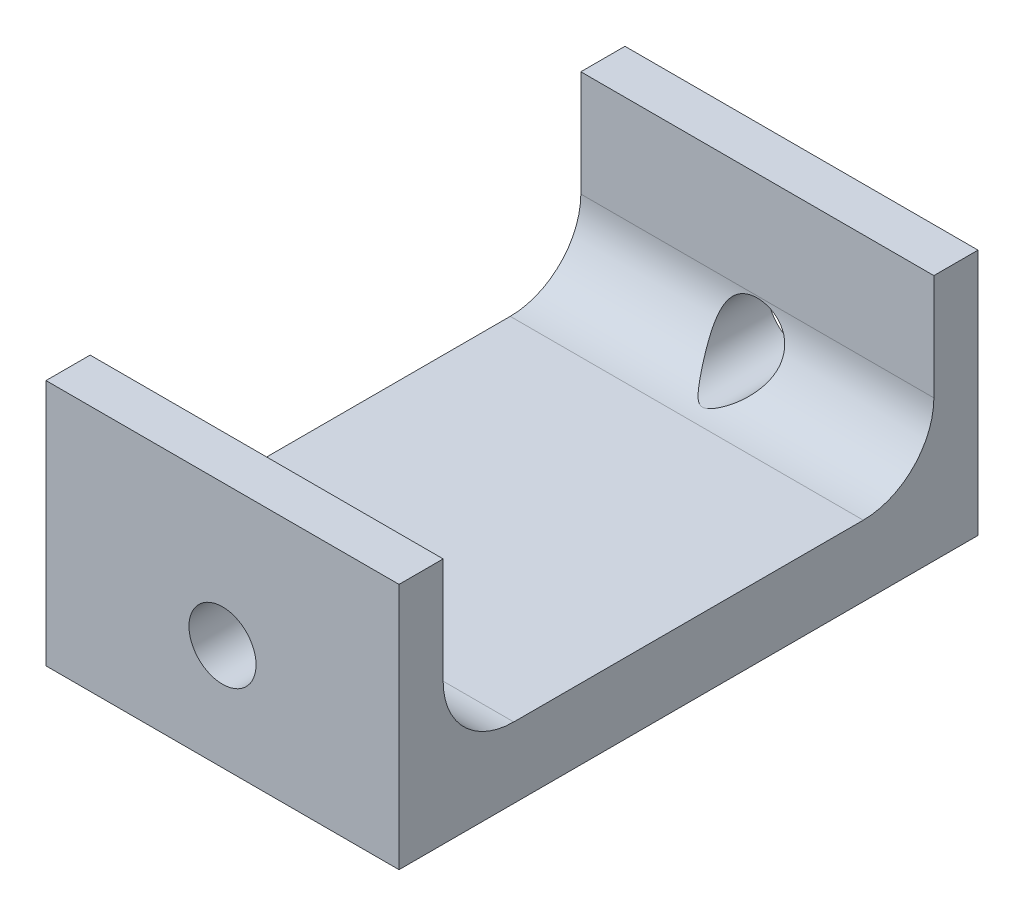
ISO-10303-21;
HEADER;
FILE_DESCRIPTION(('STEP AP214'),'2;1');
FILE_NAME('part.step','',(''),(''),'','','');
FILE_SCHEMA(('AUTOMOTIVE_DESIGN { 1 0 10303 214 1 1 1 1 }'));
ENDSEC;
DATA;
#1=APPLICATION_CONTEXT('core data for automotive mechanical design processes');
#2=APPLICATION_PROTOCOL_DEFINITION('international standard','automotive_design',2000,#1);
#3=PRODUCT_CONTEXT('',#1,'mechanical');
#4=PRODUCT('Part','Part','',(#3));
#5=PRODUCT_RELATED_PRODUCT_CATEGORY('part','',(#4));
#6=PRODUCT_DEFINITION_FORMATION('','',#4);
#7=PRODUCT_DEFINITION_CONTEXT('part definition',#1,'design');
#8=PRODUCT_DEFINITION('design','',#6,#7);
#9=PRODUCT_DEFINITION_SHAPE('','',#8);
#10=(LENGTH_UNIT() NAMED_UNIT(*) SI_UNIT(.MILLI.,.METRE.));
#11=(NAMED_UNIT(*) PLANE_ANGLE_UNIT() SI_UNIT($,.RADIAN.));
#12=(NAMED_UNIT(*) SI_UNIT($,.STERADIAN.) SOLID_ANGLE_UNIT());
#13=UNCERTAINTY_MEASURE_WITH_UNIT(LENGTH_MEASURE(1.E-05),#10,'distance_accuracy_value','');
#14=(GEOMETRIC_REPRESENTATION_CONTEXT(3) GLOBAL_UNCERTAINTY_ASSIGNED_CONTEXT((#13)) GLOBAL_UNIT_ASSIGNED_CONTEXT((#10,
#11,#12)) REPRESENTATION_CONTEXT('',''));
#15=CARTESIAN_POINT('',(0.,0.,0.));
#16=DIRECTION('',(0.,0.,1.));
#17=DIRECTION('',(1.,0.,0.));
#18=AXIS2_PLACEMENT_3D('',#15,#16,#17);
#19=CARTESIAN_POINT('',(-10.,7.,32.8));
#20=DIRECTION('',(0.,-1.,0.));
#21=DIRECTION('',(0.,0.,-1.));
#22=AXIS2_PLACEMENT_3D('',#19,#20,#21);
#23=PLANE('',#22);
#24=DIRECTION('',(0.,0.,-1.));
#25=VECTOR('',#24,1.);
#26=CARTESIAN_POINT('',(-10.,7.,32.8));
#27=LINE('',#26,#25);
#28=CARTESIAN_POINT('',(-10.,7.,2.5));
#29=VERTEX_POINT('',#28);
#30=CARTESIAN_POINT('',(-10.,7.,0.));
#31=VERTEX_POINT('',#30);
#32=EDGE_CURVE('E145',#29,#31,#27,.T.);
#33=ORIENTED_EDGE('',*,*,#32,.F.);
#34=DIRECTION('',(-1.,0.,0.));
#35=VECTOR('',#34,1.);
#36=CARTESIAN_POINT('',(-10.,7.,2.5));
#37=LINE('',#36,#35);
#38=CARTESIAN_POINT('',(10.,7.,2.5));
#39=VERTEX_POINT('',#38);
#40=EDGE_CURVE('E138',#39,#29,#37,.T.);
#41=ORIENTED_EDGE('',*,*,#40,.F.);
#42=DIRECTION('',(0.,0.,-1.));
#43=VECTOR('',#42,1.);
#44=CARTESIAN_POINT('',(10.,7.,32.8));
#45=LINE('',#44,#43);
#46=CARTESIAN_POINT('',(10.,7.,0.));
#47=VERTEX_POINT('',#46);
#48=EDGE_CURVE('E144',#39,#47,#45,.T.);
#49=ORIENTED_EDGE('',*,*,#48,.T.);
#50=DIRECTION('',(-1.,0.,0.));
#51=VECTOR('',#50,1.);
#52=CARTESIAN_POINT('',(-10.,7.,0.));
#53=LINE('',#52,#51);
#54=EDGE_CURVE('E197',#47,#31,#53,.T.);
#55=ORIENTED_EDGE('',*,*,#54,.T.);
#56=EDGE_LOOP('',(#33,#41,#49,#55));
#57=FACE_BOUND('',#56,.T.);
#58=ADVANCED_FACE('F37',(#57),#23,.F.);
#59=CARTESIAN_POINT('',(10.,7.,32.8));
#60=DIRECTION('',(-1.,0.,0.));
#61=DIRECTION('',(0.,-1.,0.));
#62=AXIS2_PLACEMENT_3D('',#59,#60,#61);
#63=PLANE('',#62);
#64=ORIENTED_EDGE('',*,*,#48,.F.);
#65=DIRECTION('',(0.,1.,0.));
#66=VECTOR('',#65,1.);
#67=CARTESIAN_POINT('',(10.,-3.,2.5));
#68=LINE('',#67,#66);
#69=CARTESIAN_POINT('',(10.,0.999999999999999,2.5));
#70=VERTEX_POINT('',#69);
#71=EDGE_CURVE('E178',#70,#39,#68,.T.);
#72=ORIENTED_EDGE('',*,*,#71,.F.);
#73=CARTESIAN_POINT('',(10.,0.999999999999999,6.5));
#74=DIRECTION('',(-1.,0.,0.));
#75=DIRECTION('',(0.,-1.,0.));
#76=AXIS2_PLACEMENT_3D('',#73,#74,#75);
#77=CIRCLE('',#76,4.);
#78=CARTESIAN_POINT('',(10.,-3.,6.5));
#79=VERTEX_POINT('',#78);
#80=EDGE_CURVE('E11',#70,#79,#77,.T.);
#81=ORIENTED_EDGE('',*,*,#80,.T.);
#82=DIRECTION('',(0.,0.,-1.));
#83=VECTOR('',#82,1.);
#84=CARTESIAN_POINT('',(10.,-3.,2.5));
#85=LINE('',#84,#83);
#86=CARTESIAN_POINT('',(10.,-3.,26.3));
#87=VERTEX_POINT('',#86);
#88=EDGE_CURVE('E129',#87,#79,#85,.T.);
#89=ORIENTED_EDGE('',*,*,#88,.F.);
#90=CARTESIAN_POINT('',(10.,0.999999999999999,26.3));
#91=DIRECTION('',(-1.,0.,0.));
#92=DIRECTION('',(0.,-1.,0.));
#93=AXIS2_PLACEMENT_3D('',#90,#91,#92);
#94=CIRCLE('',#93,4.);
#95=CARTESIAN_POINT('',(10.,0.999999999999999,30.3));
#96=VERTEX_POINT('',#95);
#97=EDGE_CURVE('E160',#87,#96,#94,.T.);
#98=ORIENTED_EDGE('',*,*,#97,.T.);
#99=DIRECTION('',(0.,1.,0.));
#100=VECTOR('',#99,1.);
#101=CARTESIAN_POINT('',(10.,-3.,30.3));
#102=LINE('',#101,#100);
#103=CARTESIAN_POINT('',(10.,7.,30.3));
#104=VERTEX_POINT('',#103);
#105=EDGE_CURVE('E128',#96,#104,#102,.T.);
#106=ORIENTED_EDGE('',*,*,#105,.T.);
#107=CARTESIAN_POINT('',(10.,7.,32.8));
#108=VERTEX_POINT('',#107);
#109=EDGE_CURVE('E137',#108,#104,#45,.T.);
#110=ORIENTED_EDGE('',*,*,#109,.F.);
#111=DIRECTION('',(0.,1.,0.));
#112=VECTOR('',#111,1.);
#113=CARTESIAN_POINT('',(10.,7.,32.8));
#114=LINE('',#113,#112);
#115=CARTESIAN_POINT('',(10.,-7.,32.8));
#116=VERTEX_POINT('',#115);
#117=EDGE_CURVE('E184',#116,#108,#114,.T.);
#118=ORIENTED_EDGE('',*,*,#117,.F.);
#119=DIRECTION('',(0.,0.,-1.));
#120=VECTOR('',#119,1.);
#121=CARTESIAN_POINT('',(10.,-7.,32.8));
#122=LINE('',#121,#120);
#123=CARTESIAN_POINT('',(10.,-7.,0.));
#124=VERTEX_POINT('',#123);
#125=EDGE_CURVE('E193',#116,#124,#122,.T.);
#126=ORIENTED_EDGE('',*,*,#125,.T.);
#127=DIRECTION('',(0.,1.,0.));
#128=VECTOR('',#127,1.);
#129=CARTESIAN_POINT('',(10.,7.,0.));
#130=LINE('',#129,#128);
#131=EDGE_CURVE('E194',#124,#47,#130,.T.);
#132=ORIENTED_EDGE('',*,*,#131,.T.);
#133=EDGE_LOOP('',(#64,#72,#81,#89,#98,#106,#110,#118,#126,#132));
#134=FACE_BOUND('',#133,.T.);
#135=ADVANCED_FACE('F177',(#134),#63,.F.);
#136=ORIENTED_EDGE('',*,*,#109,.T.);
#137=DIRECTION('',(1.,0.,0.));
#138=VECTOR('',#137,1.);
#139=CARTESIAN_POINT('',(-9.99999999999999,7.,30.3));
#140=LINE('',#139,#138);
#141=CARTESIAN_POINT('',(-9.99999999999999,7.,30.3));
#142=VERTEX_POINT('',#141);
#143=EDGE_CURVE('E122',#142,#104,#140,.T.);
#144=ORIENTED_EDGE('',*,*,#143,.F.);
#145=CARTESIAN_POINT('',(-10.,7.,32.8));
#146=VERTEX_POINT('',#145);
#147=EDGE_CURVE('E134',#146,#142,#27,.T.);
#148=ORIENTED_EDGE('',*,*,#147,.F.);
#149=DIRECTION('',(-1.,0.,0.));
#150=VECTOR('',#149,1.);
#151=CARTESIAN_POINT('',(-10.,7.,32.8));
#152=LINE('',#151,#150);
#153=EDGE_CURVE('E187',#108,#146,#152,.T.);
#154=ORIENTED_EDGE('',*,*,#153,.F.);
#155=EDGE_LOOP('',(#136,#144,#148,#154));
#156=FACE_BOUND('',#155,.T.);
#157=ADVANCED_FACE('F133',(#156),#23,.F.);
#158=CARTESIAN_POINT('',(-10.,7.,32.8));
#159=DIRECTION('',(1.,0.,0.));
#160=DIRECTION('',(0.,0.,-1.));
#161=AXIS2_PLACEMENT_3D('',#158,#159,#160);
#162=PLANE('',#161);
#163=DIRECTION('',(0.,0.,1.));
#164=VECTOR('',#163,1.);
#165=CARTESIAN_POINT('',(-10.,-3.,2.5));
#166=LINE('',#165,#164);
#167=CARTESIAN_POINT('',(-10.,-3.,6.5));
#168=VERTEX_POINT('',#167);
#169=CARTESIAN_POINT('',(-9.99999999999999,-3.,26.3));
#170=VERTEX_POINT('',#169);
#171=EDGE_CURVE('E165',#168,#170,#166,.T.);
#172=ORIENTED_EDGE('',*,*,#171,.F.);
#173=CARTESIAN_POINT('',(-10.,0.999999999999999,6.5));
#174=DIRECTION('',(1.,0.,0.));
#175=DIRECTION('',(0.,0.,-1.));
#176=AXIS2_PLACEMENT_3D('',#173,#174,#175);
#177=CIRCLE('',#176,4.);
#178=CARTESIAN_POINT('',(-10.,0.999999999999999,2.5));
#179=VERTEX_POINT('',#178);
#180=EDGE_CURVE('E51',#168,#179,#177,.T.);
#181=ORIENTED_EDGE('',*,*,#180,.T.);
#182=DIRECTION('',(0.,1.,0.));
#183=VECTOR('',#182,1.);
#184=CARTESIAN_POINT('',(-10.,-3.,2.5));
#185=LINE('',#184,#183);
#186=EDGE_CURVE('E180',#179,#29,#185,.T.);
#187=ORIENTED_EDGE('',*,*,#186,.T.);
#188=ORIENTED_EDGE('',*,*,#32,.T.);
#189=DIRECTION('',(0.,-1.,0.));
#190=VECTOR('',#189,1.);
#191=CARTESIAN_POINT('',(-10.,7.,0.));
#192=LINE('',#191,#190);
#193=CARTESIAN_POINT('',(-10.,-7.,0.));
#194=VERTEX_POINT('',#193);
#195=EDGE_CURVE('E200',#31,#194,#192,.T.);
#196=ORIENTED_EDGE('',*,*,#195,.T.);
#197=DIRECTION('',(0.,0.,-1.));
#198=VECTOR('',#197,1.);
#199=CARTESIAN_POINT('',(-10.,-7.,32.8));
#200=LINE('',#199,#198);
#201=CARTESIAN_POINT('',(-10.,-7.,32.8));
#202=VERTEX_POINT('',#201);
#203=EDGE_CURVE('E148',#202,#194,#200,.T.);
#204=ORIENTED_EDGE('',*,*,#203,.F.);
#205=DIRECTION('',(0.,-1.,0.));
#206=VECTOR('',#205,1.);
#207=CARTESIAN_POINT('',(-10.,7.,32.8));
#208=LINE('',#207,#206);
#209=EDGE_CURVE('E143',#146,#202,#208,.T.);
#210=ORIENTED_EDGE('',*,*,#209,.F.);
#211=ORIENTED_EDGE('',*,*,#147,.T.);
#212=DIRECTION('',(0.,1.,0.));
#213=VECTOR('',#212,1.);
#214=CARTESIAN_POINT('',(-9.99999999999999,-3.,30.3));
#215=LINE('',#214,#213);
#216=CARTESIAN_POINT('',(-9.99999999999999,0.999999999999999,30.3));
#217=VERTEX_POINT('',#216);
#218=EDGE_CURVE('E118',#217,#142,#215,.T.);
#219=ORIENTED_EDGE('',*,*,#218,.F.);
#220=CARTESIAN_POINT('',(-10.,0.999999999999999,26.3));
#221=DIRECTION('',(1.,0.,0.));
#222=DIRECTION('',(0.,0.,-1.));
#223=AXIS2_PLACEMENT_3D('',#220,#221,#222);
#224=CIRCLE('',#223,4.);
#225=EDGE_CURVE('E162',#217,#170,#224,.T.);
#226=ORIENTED_EDGE('',*,*,#225,.T.);
#227=EDGE_LOOP('',(#172,#181,#187,#188,#196,#204,#210,#211,#219,#226));
#228=FACE_BOUND('',#227,.T.);
#229=ADVANCED_FACE('F141',(#228),#162,.F.);
#230=CARTESIAN_POINT('',(-10.,-7.,32.8));
#231=DIRECTION('',(0.,1.,0.));
#232=DIRECTION('',(0.,0.,1.));
#233=AXIS2_PLACEMENT_3D('',#230,#231,#232);
#234=PLANE('',#233);
#235=DIRECTION('',(1.,0.,0.));
#236=VECTOR('',#235,1.);
#237=CARTESIAN_POINT('',(-10.,-7.,0.));
#238=LINE('',#237,#236);
#239=EDGE_CURVE('E188',#194,#124,#238,.T.);
#240=ORIENTED_EDGE('',*,*,#239,.T.);
#241=ORIENTED_EDGE('',*,*,#125,.F.);
#242=DIRECTION('',(1.,0.,0.));
#243=VECTOR('',#242,1.);
#244=CARTESIAN_POINT('',(-10.,-7.,32.8));
#245=LINE('',#244,#243);
#246=EDGE_CURVE('E191',#202,#116,#245,.T.);
#247=ORIENTED_EDGE('',*,*,#246,.F.);
#248=ORIENTED_EDGE('',*,*,#203,.T.);
#249=EDGE_LOOP('',(#240,#241,#247,#248));
#250=FACE_BOUND('',#249,.T.);
#251=ADVANCED_FACE('F210',(#250),#234,.F.);
#252=CARTESIAN_POINT('',(0.,0.,32.8));
#253=DIRECTION('',(0.,0.,1.));
#254=DIRECTION('',(1.,0.,0.));
#255=AXIS2_PLACEMENT_3D('',#252,#253,#254);
#256=PLANE('',#255);
#257=CARTESIAN_POINT('',(0.,-1.,32.8));
#258=DIRECTION('',(0.,0.,1.));
#259=DIRECTION('',(1.,0.,0.));
#260=AXIS2_PLACEMENT_3D('',#257,#258,#259);
#261=CIRCLE('',#260,1.9);
#262=CARTESIAN_POINT('',(1.9,-1.,32.8));
#263=VERTEX_POINT('',#262);
#264=EDGE_CURVE('E139',#263,#263,#261,.T.);
#265=ORIENTED_EDGE('',*,*,#264,.F.);
#266=EDGE_LOOP('',(#265));
#267=FACE_BOUND('',#266,.T.);
#268=ORIENTED_EDGE('',*,*,#117,.T.);
#269=ORIENTED_EDGE('',*,*,#153,.T.);
#270=ORIENTED_EDGE('',*,*,#209,.T.);
#271=ORIENTED_EDGE('',*,*,#246,.T.);
#272=EDGE_LOOP('',(#268,#269,#270,#271));
#273=FACE_BOUND('',#272,.T.);
#274=ADVANCED_FACE('F249',(#267,#273),#256,.T.);
#275=CARTESIAN_POINT('',(0.,0.,0.));
#276=DIRECTION('',(0.,0.,1.));
#277=DIRECTION('',(1.,0.,0.));
#278=AXIS2_PLACEMENT_3D('',#275,#276,#277);
#279=PLANE('',#278);
#280=CARTESIAN_POINT('',(0.,-1.,0.));
#281=DIRECTION('',(0.,0.,-1.));
#282=DIRECTION('',(-1.,0.,0.));
#283=AXIS2_PLACEMENT_3D('',#280,#281,#282);
#284=CIRCLE('',#283,1.9);
#285=CARTESIAN_POINT('',(-1.9,-1.,0.));
#286=VERTEX_POINT('',#285);
#287=EDGE_CURVE('E233',#286,#286,#284,.T.);
#288=ORIENTED_EDGE('',*,*,#287,.F.);
#289=EDGE_LOOP('',(#288));
#290=FACE_BOUND('',#289,.T.);
#291=ORIENTED_EDGE('',*,*,#131,.F.);
#292=ORIENTED_EDGE('',*,*,#239,.F.);
#293=ORIENTED_EDGE('',*,*,#195,.F.);
#294=ORIENTED_EDGE('',*,*,#54,.F.);
#295=EDGE_LOOP('',(#291,#292,#293,#294));
#296=FACE_BOUND('',#295,.T.);
#297=ADVANCED_FACE('F213',(#290,#296),#279,.F.);
#298=CARTESIAN_POINT('',(-10.,-3.,2.5));
#299=DIRECTION('',(0.,0.,-1.));
#300=DIRECTION('',(-1.,0.,0.));
#301=AXIS2_PLACEMENT_3D('',#298,#299,#300);
#302=PLANE('',#301);
#303=ORIENTED_EDGE('',*,*,#186,.F.);
#304=DIRECTION('',(-1.,0.,0.));
#305=VECTOR('',#304,1.);
#306=CARTESIAN_POINT('',(-10.,0.999999999999999,2.5));
#307=LINE('',#306,#305);
#308=EDGE_CURVE('E58',#179,#70,#307,.F.);
#309=ORIENTED_EDGE('',*,*,#308,.T.);
#310=ORIENTED_EDGE('',*,*,#71,.T.);
#311=ORIENTED_EDGE('',*,*,#40,.T.);
#312=EDGE_LOOP('',(#303,#309,#310,#311));
#313=FACE_BOUND('',#312,.T.);
#314=ADVANCED_FACE('F222',(#313),#302,.F.);
#315=CARTESIAN_POINT('',(-9.99999999999999,-3.,30.3));
#316=DIRECTION('',(0.,0.,1.));
#317=DIRECTION('',(1.,0.,0.));
#318=AXIS2_PLACEMENT_3D('',#315,#316,#317);
#319=PLANE('',#318);
#320=ORIENTED_EDGE('',*,*,#105,.F.);
#321=DIRECTION('',(1.,0.,0.));
#322=VECTOR('',#321,1.);
#323=CARTESIAN_POINT('',(-9.99999999999999,0.999999999999999,30.3));
#324=LINE('',#323,#322);
#325=EDGE_CURVE('E125',#96,#217,#324,.F.);
#326=ORIENTED_EDGE('',*,*,#325,.T.);
#327=ORIENTED_EDGE('',*,*,#218,.T.);
#328=ORIENTED_EDGE('',*,*,#143,.T.);
#329=EDGE_LOOP('',(#320,#326,#327,#328));
#330=FACE_BOUND('',#329,.T.);
#331=ADVANCED_FACE('F121',(#330),#319,.F.);
#332=CARTESIAN_POINT('',(0.,-3.,0.));
#333=DIRECTION('',(0.,1.,0.));
#334=DIRECTION('',(0.,0.,1.));
#335=AXIS2_PLACEMENT_3D('',#332,#333,#334);
#336=PLANE('',#335);
#337=ORIENTED_EDGE('',*,*,#171,.T.);
#338=DIRECTION('',(1.,0.,0.));
#339=VECTOR('',#338,1.);
#340=CARTESIAN_POINT('',(0.,-3.,26.3));
#341=LINE('',#340,#339);
#342=EDGE_CURVE('E155',#170,#87,#341,.T.);
#343=ORIENTED_EDGE('',*,*,#342,.T.);
#344=ORIENTED_EDGE('',*,*,#88,.T.);
#345=DIRECTION('',(-1.,0.,0.));
#346=VECTOR('',#345,1.);
#347=CARTESIAN_POINT('',(0.,-3.,6.5));
#348=LINE('',#347,#346);
#349=EDGE_CURVE('E152',#79,#168,#348,.T.);
#350=ORIENTED_EDGE('',*,*,#349,.T.);
#351=EDGE_LOOP('',(#337,#343,#344,#350));
#352=FACE_BOUND('',#351,.T.);
#353=ADVANCED_FACE('F169',(#352),#336,.T.);
#354=CARTESIAN_POINT('',(0.,0.999999999999999,26.3));
#355=DIRECTION('',(1.,0.,0.));
#356=DIRECTION('',(0.,0.,-1.));
#357=AXIS2_PLACEMENT_3D('',#354,#355,#356);
#358=CYLINDRICAL_SURFACE('',#357,4.);
#359=CARTESIAN_POINT('',(-1.9,-1.,29.7641016151378));
#360=CARTESIAN_POINT('',(-1.899999605359,-1.07024498839208,29.7235444988013));
#361=CARTESIAN_POINT('',(-1.89609934237732,-1.1392777725351,29.6808296172709));
#362=CARTESIAN_POINT('',(-1.88134485943445,-1.27414129039414,29.5916311137471));
#363=CARTESIAN_POINT('',(-1.87048278779536,-1.33996831828017,29.545143288314));
#364=CARTESIAN_POINT('',(-1.84259289640303,-1.46815855390958,29.448753494538));
#365=CARTESIAN_POINT('',(-1.82553797568571,-1.53050512516958,29.3988373139267));
#366=CARTESIAN_POINT('',(-1.78608574402346,-1.65109299057053,29.2963280621192));
#367=CARTESIAN_POINT('',(-1.7636895134653,-1.70933511183621,29.243735533958));
#368=CARTESIAN_POINT('',(-1.68089477618601,-1.89743684781598,29.0637176503639));
#369=CARTESIAN_POINT('',(-1.60999114355276,-2.01790695058172,28.9310605015427));
#370=CARTESIAN_POINT('',(-1.48988407155619,-2.18102506070845,28.7266751900712));
#371=CARTESIAN_POINT('',(-1.44749628750534,-2.23251864308641,28.6575591705072));
#372=CARTESIAN_POINT('',(-1.35861828055801,-2.32984765269452,28.5179570415966));
#373=CARTESIAN_POINT('',(-1.31212859173489,-2.37568381466943,28.447471111543));
#374=CARTESIAN_POINT('',(-1.21370230744125,-2.4633625043703,28.3031258215236));
#375=CARTESIAN_POINT('',(-1.16162973611348,-2.50500137781645,28.2292364800312));
#376=CARTESIAN_POINT('',(-1.05362275631353,-2.58249864771685,28.0812006085322));
#377=CARTESIAN_POINT('',(-0.997687144311122,-2.61835523098945,28.0070540052711));
#378=CARTESIAN_POINT('',(-0.881946711725713,-2.68421598799142,27.8598181492007));
#379=CARTESIAN_POINT('',(-0.8221610196659,-2.71424650859792,27.7867255890653));
#380=CARTESIAN_POINT('',(-0.697459513624475,-2.76867660560624,27.6427375559309));
#381=CARTESIAN_POINT('',(-0.632544713872778,-2.79307729152949,27.5718416524057));
#382=CARTESIAN_POINT('',(-0.529993147760967,-2.8249197890925,27.4709863274377));
#383=CARTESIAN_POINT('',(-0.495411609413804,-2.83464711772746,27.4386560432954));
#384=CARTESIAN_POINT('',(-0.42366982365252,-2.85253192568389,27.3765817320733));
#385=CARTESIAN_POINT('',(-0.386514838747417,-2.86069248706356,27.3468326918637));
#386=CARTESIAN_POINT('',(-0.316919798864763,-2.87364163540398,27.297699271452));
#387=CARTESIAN_POINT('',(-0.285162288958692,-2.87877820560645,27.2774571400404));
#388=CARTESIAN_POINT('',(-0.218934837436511,-2.88763734958066,27.2416023776581));
#389=CARTESIAN_POINT('',(-0.184474300739312,-2.89136458461097,27.2259745236116));
#390=CARTESIAN_POINT('',(-0.124790555960633,-2.89604864004707,27.2060214814817));
#391=CARTESIAN_POINT('',(-0.100303518752084,-2.89751450617478,27.1996660637661));
#392=CARTESIAN_POINT('',(-0.0505898735488473,-2.89948841637224,27.1910727284264));
#393=CARTESIAN_POINT('',(-0.0253646639540157,-2.89999816576577,27.1888274801024));
#394=CARTESIAN_POINT('',(0.0251498090105132,-2.90000182864452,27.1888114279121));
#395=CARTESIAN_POINT('',(0.0504390769073971,-2.89949323345582,27.1910516739819));
#396=CARTESIAN_POINT('',(0.100270835955496,-2.89751697594238,27.1996553906153));
#397=CARTESIAN_POINT('',(0.124812129756236,-2.89604785256871,27.2060251424002));
#398=CARTESIAN_POINT('',(0.184668882853456,-2.89134794913786,27.2260449375528));
#399=CARTESIAN_POINT('',(0.219241602670733,-2.88760373879437,27.2417423236438));
#400=CARTESIAN_POINT('',(0.285696787418424,-2.87869912744338,27.2777731925062));
#401=CARTESIAN_POINT('',(0.317567786312588,-2.87353305068014,27.2981251991918));
#402=CARTESIAN_POINT('',(0.394622237041002,-2.85916554420393,27.3526051770901));
#403=CARTESIAN_POINT('',(0.438397426219599,-2.8492439373612,27.3884986083849));
#404=CARTESIAN_POINT('',(0.522558987562268,-2.82724388965462,27.4635082137405));
#405=CARTESIAN_POINT('',(0.562936928368946,-2.81516030255426,27.502631954659));
#406=CARTESIAN_POINT('',(0.641402947257093,-2.78894367526431,27.5828464171625));
#407=CARTESIAN_POINT('',(0.679478647656981,-2.77480074798889,27.6239459480693));
#408=CARTESIAN_POINT('',(0.753699241966174,-2.7445743594403,27.7071706750877));
#409=CARTESIAN_POINT('',(0.789843417978216,-2.72849018379416,27.7492962441981));
#410=CARTESIAN_POINT('',(0.897315707466506,-2.67667933854326,27.8781947137669));
#411=CARTESIAN_POINT('',(0.966151133168201,-2.63791781894028,27.9658480927715));
#412=CARTESIAN_POINT('',(1.09842876217838,-2.55230314797534,28.1413904958889));
#413=CARTESIAN_POINT('',(1.1618655267426,-2.50544197752629,28.2292796677375));
#414=CARTESIAN_POINT('',(1.28303705907315,-2.40358731568416,28.4037482742571));
#415=CARTESIAN_POINT('',(1.34079101773965,-2.34862287918298,28.4903312178201));
#416=CARTESIAN_POINT('',(1.45017658740714,-2.23023342509981,28.6614431312462));
#417=CARTESIAN_POINT('',(1.50181281067716,-2.16681485889128,28.7459736097755));
#418=CARTESIAN_POINT('',(1.61433045176019,-2.00814666062789,28.9403982265758));
#419=CARTESIAN_POINT('',(1.67238349167775,-1.90940678652292,29.049141061654));
#420=CARTESIAN_POINT('',(1.7717652242185,-1.69615845150863,29.2585413559212));
#421=CARTESIAN_POINT('',(1.81311714608693,-1.58167219131384,29.3592098881158));
#422=CARTESIAN_POINT('',(1.86737546850853,-1.3642084215165,29.5288213208173));
#423=CARTESIAN_POINT('',(1.88447036747521,-1.26399335118962,29.5999486393095));
#424=CARTESIAN_POINT('',(1.90201574731961,-1.05619870071609,29.7332482773848));
#425=CARTESIAN_POINT('',(1.9024743316147,-0.948622731589673,29.7954249420596));
#426=CARTESIAN_POINT('',(1.88848058795599,-0.783813411139956,29.8807721873528));
#427=CARTESIAN_POINT('',(1.88129111292905,-0.727997203284136,29.9080247981042));
#428=CARTESIAN_POINT('',(1.86164700232784,-0.6159431412133,29.9595788637891));
#429=CARTESIAN_POINT('',(1.8491952301166,-0.559705532616414,29.9838819144174));
#430=CARTESIAN_POINT('',(1.81881926478587,-0.447485489035981,30.0294036027692));
#431=CARTESIAN_POINT('',(1.80089770401128,-0.391502944426701,30.0506237169262));
#432=CARTESIAN_POINT('',(1.75950954595622,-0.280528602495487,30.0899496969484));
#433=CARTESIAN_POINT('',(1.73604392463862,-0.225536632626878,30.1080561099737));
#434=CARTESIAN_POINT('',(1.66524757913882,-0.0794863637361049,30.1527789588282));
#435=CARTESIAN_POINT('',(1.61268353324027,0.00999069596641775,30.1765290243321));
#436=CARTESIAN_POINT('',(1.49264798734235,0.180195630096162,30.2160683910402));
#437=CARTESIAN_POINT('',(1.42517862365396,0.260924755855801,30.2318588319977));
#438=CARTESIAN_POINT('',(1.28102021105978,0.406755181362632,30.2564196291595));
#439=CARTESIAN_POINT('',(1.20497643719075,0.4724433323556,30.2655067987213));
#440=CARTESIAN_POINT('',(1.04323598278485,0.591139686790705,30.2794993841954));
#441=CARTESIAN_POINT('',(0.957538706838279,0.64414710747891,30.2844045420091));
#442=CARTESIAN_POINT('',(0.775939424334442,0.737429971974827,30.2916568826916));
#443=CARTESIAN_POINT('',(0.679801053842424,0.777251935612693,30.2939186531966));
#444=CARTESIAN_POINT('',(0.482293965039563,0.840694328240348,30.2969533239334));
#445=CARTESIAN_POINT('',(0.380924547710983,0.86431258589138,30.2977260246511));
#446=CARTESIAN_POINT('',(0.173105424530249,0.895083300065942,30.2986550405024));
#447=CARTESIAN_POINT('',(0.0665920670268177,0.901808071012746,30.2987954155793));
#448=CARTESIAN_POINT('',(-0.146063482937087,0.897360824189094,30.2986833674349));
#449=CARTESIAN_POINT('',(-0.252205652068096,0.886187701085544,30.2984309199539));
#450=CARTESIAN_POINT('',(-0.461557668769814,0.846176443107118,30.297091015625));
#451=CARTESIAN_POINT('',(-0.564753677590561,0.817265921742332,30.2960001324788));
#452=CARTESIAN_POINT('',(-0.764808625924053,0.742546444234004,30.2918803657432));
#453=CARTESIAN_POINT('',(-0.861667237512272,0.696736614459541,30.2888513819555));
#454=CARTESIAN_POINT('',(-1.04577652966759,0.589851060417754,30.2792753128782));
#455=CARTESIAN_POINT('',(-1.13307006152373,0.528847797604504,30.2727447617466));
#456=CARTESIAN_POINT('',(-1.29592857279776,0.393474162927316,30.2543360429264));
#457=CARTESIAN_POINT('',(-1.37149775197055,0.319108598240804,30.2424597960825));
#458=CARTESIAN_POINT('',(-1.50673318084276,0.161978957195818,30.2120237010314));
#459=CARTESIAN_POINT('',(-1.56678810940493,0.0795111948396363,30.1936619719077));
#460=CARTESIAN_POINT('',(-1.6722309532082,-0.0923636126191469,30.1489748637044));
#461=CARTESIAN_POINT('',(-1.71761879783842,-0.181770691126718,30.1226494462867));
#462=CARTESIAN_POINT('',(-1.79208995977638,-0.361537565694366,30.0623086621851));
#463=CARTESIAN_POINT('',(-1.8215804843868,-0.451806430238421,30.0285201632453));
#464=CARTESIAN_POINT('',(-1.8664255676977,-0.632436300742142,29.9530411089848));
#465=CARTESIAN_POINT('',(-1.88179525366409,-0.722797104040421,29.9113590676912));
#466=CARTESIAN_POINT('',(-1.89382148328765,-0.843593780619279,29.8499917541315));
#467=CARTESIAN_POINT('',(-1.89615534454067,-0.875167225183637,29.8334153715604));
#468=CARTESIAN_POINT('',(-1.89924425575818,-0.937905308770344,29.7993989906805));
#469=CARTESIAN_POINT('',(-1.90000017376587,-0.96907016318041,29.7819594726002));
#470=CARTESIAN_POINT('',(-1.9,-1.,29.7641016151378));
#471=B_SPLINE_CURVE_WITH_KNOTS('',3,(#359,#360,#361,#362,#363,#364,#365,#366,#367,#368,#369,
#370,#371,#372,#373,#374,#375,#376,#377,#378,#379,#380,#381,#382,#383,#384,#385,#386,#387,#388,
#389,#390,#391,#392,#393,#394,#395,#396,#397,#398,#399,#400,#401,#402,#403,#404,#405,#406,#407,
#408,#409,#410,#411,#412,#413,#414,#415,#416,#417,#418,#419,#420,#421,#422,#423,#424,#425,#426,
#427,#428,#429,#430,#431,#432,#433,#434,#435,#436,#437,#438,#439,#440,#441,#442,#443,#444,#445,
#446,#447,#448,#449,#450,#451,#452,#453,#454,#455,#456,#457,#458,#459,#460,#461,#462,#463,#464,
#465,#466,#467,#468,#469,#470),.UNSPECIFIED.,.T.,.F.,(4,2,2,2,2,2,2,2,2,2,2,2,2,2,2,2,2,2,2,2,2,
2,2,2,2,2,2,2,2,2,2,2,2,2,2,2,2,2,2,2,2,2,2,2,2,2,2,2,2,2,2,2,2,2,2,4),(0.,0.243279278007784,
0.486833415598739,0.731466492682154,0.976050129736293,1.5506126678924,1.83859764011306,
2.12654517149038,2.42487774705746,2.72330369111381,3.02034690266667,3.31733152318079,
3.46222550428733,3.60683147007729,3.72062152804409,3.83403187262047,3.90975189895375,
3.98533674262678,4.06110801732151,4.13699481585777,4.25079466833566,4.3650555414321,
4.53703721587631,4.7094338466484,4.8826872689681,5.05600464349083,5.40953066002527,
5.76340871233173,6.11604745030639,6.46841861272417,6.94063133506886,7.41218498556131,
7.78304911225817,8.15373259154405,8.34107348825186,8.52831257852075,8.71546170137027,
8.90257790346094,9.22013196693093,9.53764054632369,9.83896440649418,10.1403068619353,
10.4511383474181,10.7620114769973,11.0806789665412,11.3993661370208,11.7193626045218,
12.0393756169598,12.3578906886971,12.6762914010994,12.9857046812102,13.2951194508888,
13.5961783957139,13.8969144470308,14.0040926425094,14.1112118625791),.UNSPECIFIED.);
#472=CARTESIAN_POINT('',(-1.9,-1.,29.7641016151378));
#473=VERTEX_POINT('',#472);
#474=EDGE_CURVE('E227',#473,#473,#471,.T.);
#475=ORIENTED_EDGE('',*,*,#474,.T.);
#476=EDGE_LOOP('',(#475));
#477=FACE_BOUND('',#476,.T.);
#478=ORIENTED_EDGE('',*,*,#225,.F.);
#479=ORIENTED_EDGE('',*,*,#325,.F.);
#480=ORIENTED_EDGE('',*,*,#97,.F.);
#481=ORIENTED_EDGE('',*,*,#342,.F.);
#482=EDGE_LOOP('',(#478,#479,#480,#481));
#483=FACE_BOUND('',#482,.T.);
#484=ADVANCED_FACE('F174',(#477,#483),#358,.F.);
#485=CARTESIAN_POINT('',(0.,0.999999999999999,6.5));
#486=DIRECTION('',(-1.,0.,0.));
#487=DIRECTION('',(0.,0.,1.));
#488=AXIS2_PLACEMENT_3D('',#485,#486,#487);
#489=CYLINDRICAL_SURFACE('',#488,4.);
#490=CARTESIAN_POINT('',(-1.9,-1.,3.03589838486225));
#491=CARTESIAN_POINT('',(-1.89999721846667,-0.907001271006328,2.98220823679785));
#492=CARTESIAN_POINT('',(-1.89315586028141,-0.811785745997216,2.93226040202763));
#493=CARTESIAN_POINT('',(-1.8640519552393,-0.619540854107143,2.8409839104234));
#494=CARTESIAN_POINT('',(-1.84179261309278,-0.522511868241022,2.79965346474126));
#495=CARTESIAN_POINT('',(-1.78071073663604,-0.32967735144977,2.72605614529643));
#496=CARTESIAN_POINT('',(-1.74181892518704,-0.233878683624705,2.69382812759376));
#497=CARTESIAN_POINT('',(-1.64754259623467,-0.0479162999222387,2.63848567311477));
#498=CARTESIAN_POINT('',(-1.59215980688808,0.042248005205736,2.61537028197875));
#499=CARTESIAN_POINT('',(-1.47016032000684,0.207694003831682,2.57839345938847));
#500=CARTESIAN_POINT('',(-1.40447572810428,0.283556314315975,2.56403919002708));
#501=CARTESIAN_POINT('',(-1.26145328162536,0.424362169548187,2.54099245238546));
#502=CARTESIAN_POINT('',(-1.18411458286224,0.489304922596156,2.53230039450097));
#503=CARTESIAN_POINT('',(-1.01911355253738,0.606787254523752,2.51892918478678));
#504=CARTESIAN_POINT('',(-0.931359773989741,0.659202599279698,2.51428910633136));
#505=CARTESIAN_POINT('',(-0.748508201559003,0.749322534240642,2.50760601266317));
#506=CARTESIAN_POINT('',(-0.653409411352467,0.787025124502371,2.50556335043882));
#507=CARTESIAN_POINT('',(-0.455015578831107,0.847724686118666,2.50277887293522));
#508=CARTESIAN_POINT('',(-0.351551128549533,0.870171241680422,2.50208421789379));
#509=CARTESIAN_POINT('',(-0.142328144694278,0.897597761834214,2.50128719376513));
#510=CARTESIAN_POINT('',(-0.0365694367431334,0.902576394045211,2.50118486985809));
#511=CARTESIAN_POINT('',(0.175529761872501,0.894882159979534,2.50137947964219));
#512=CARTESIAN_POINT('',(0.281862915162009,0.882005247200883,2.50168102727636));
#513=CARTESIAN_POINT('',(0.490865593102167,0.838598286182107,2.50319935968008));
#514=CARTESIAN_POINT('',(0.593534835160223,0.808066879385269,2.50441621488696));
#515=CARTESIAN_POINT('',(0.792234481768863,0.730243932606223,2.50891720266371));
#516=CARTESIAN_POINT('',(0.888266989097544,0.682957730564797,2.51220067708393));
#517=CARTESIAN_POINT('',(1.0709089269643,0.573056663011941,2.52246910808319));
#518=CARTESIAN_POINT('',(1.15751947317115,0.510443615235636,2.52945362583975));
#519=CARTESIAN_POINT('',(1.3174286237936,0.373067235064667,2.54883862426503));
#520=CARTESIAN_POINT('',(1.39091640535355,0.298512136081133,2.56115153852422));
#521=CARTESIAN_POINT('',(1.52407379968107,0.139280330760997,2.59286173959428));
#522=CARTESIAN_POINT('',(1.58374884813116,0.0546076259325571,2.61225623184249));
#523=CARTESIAN_POINT('',(1.68594351435633,-0.11834186532751,2.65851273169157));
#524=CARTESIAN_POINT('',(1.72900429185131,-0.206378487086383,2.685080150664));
#525=CARTESIAN_POINT('',(1.80045605037443,-0.385463247533598,2.74640900283813));
#526=CARTESIAN_POINT('',(1.82884777672079,-0.476511232967741,2.78117001960152));
#527=CARTESIAN_POINT('',(1.8715344619551,-0.659097784632796,2.85894163101626));
#528=CARTESIAN_POINT('',(1.88573288486575,-0.750635509357187,2.90200637444525));
#529=CARTESIAN_POINT('',(1.90090621071845,-0.930986759391285,2.99548297746169));
#530=CARTESIAN_POINT('',(1.90187324234547,-1.01979863176073,3.04589919239722));
#531=CARTESIAN_POINT('',(1.89034084974378,-1.22551768762313,3.17333857068035));
#532=CARTESIAN_POINT('',(1.87261773885058,-1.3403683136125,3.25321938065991));
#533=CARTESIAN_POINT('',(1.81952680517174,-1.55855816835146,3.42218421398203));
#534=CARTESIAN_POINT('',(1.78413108838264,-1.66187888214046,3.51128260931788));
#535=CARTESIAN_POINT('',(1.68420258114263,-1.89122749201748,3.72978226296568));
#536=CARTESIAN_POINT('',(1.613759806896,-2.01192452881007,3.86209209577611));
#537=CARTESIAN_POINT('',(1.49421141282236,-2.17554860350644,4.06616081280286));
#538=CARTESIAN_POINT('',(1.45195233110648,-2.2272697088031,4.13525727134233));
#539=CARTESIAN_POINT('',(1.36331496299078,-2.32503710366046,4.27483255065317));
#540=CARTESIAN_POINT('',(1.31693729565679,-2.3710842436007,4.345311162436));
#541=CARTESIAN_POINT('',(1.21888543676903,-2.4590408029994,4.48942778652004));
#542=CARTESIAN_POINT('',(1.16708750878517,-2.50076526599515,4.56309366472079));
#543=CARTESIAN_POINT('',(1.05965346859765,-2.57845941405341,4.71070479360173));
#544=CARTESIAN_POINT('',(1.00401625111081,-2.61442743193244,4.78465011889118));
#545=CARTESIAN_POINT('',(0.88892278993141,-2.68053567571352,4.93152385771242));
#546=CARTESIAN_POINT('',(0.829485972887374,-2.71070281116041,5.00445543541877));
#547=CARTESIAN_POINT('',(0.705576004808961,-2.76544228266512,5.14822046077397));
#548=CARTESIAN_POINT('',(0.641103628937078,-2.79001547757055,5.21905422904854));
#549=CARTESIAN_POINT('',(0.538818867762169,-2.82234065113136,5.32060276205417));
#550=CARTESIAN_POINT('',(0.503941088509584,-2.8323297352124,5.35354930589269));
#551=CARTESIAN_POINT('',(0.431596740185692,-2.85070827037096,5.41689310343163));
#552=CARTESIAN_POINT('',(0.394135280182644,-2.85910076166444,5.44729513922882));
#553=CARTESIAN_POINT('',(0.323762187167717,-2.87247966729241,5.49778407447379));
#554=CARTESIAN_POINT('',(0.291523857639441,-2.87781146103966,5.51870143351076));
#555=CARTESIAN_POINT('',(0.224244801121099,-2.88702356059112,5.55585391696802));
#556=CARTESIAN_POINT('',(0.189214027694439,-2.89090876451293,5.57210479839775));
#557=CARTESIAN_POINT('',(0.128881832918318,-2.89577506854747,5.59280080955905));
#558=CARTESIAN_POINT('',(0.104376136794012,-2.8972953760251,5.59938393201215));
#559=CARTESIAN_POINT('',(0.0545881071572943,-2.89937821796927,5.60844395997905));
#560=CARTESIAN_POINT('',(0.0293072967282314,-2.89994252178387,5.61092845091511));
#561=CARTESIAN_POINT('',(-0.0213753791533747,-2.90004920044732,5.61139634418906));
#562=CARTESIAN_POINT('',(-0.0467773813998458,-2.89958854441838,5.60936639702706));
#563=CARTESIAN_POINT('',(-0.0968589826937094,-2.8976958277458,5.60112070385114));
#564=CARTESIAN_POINT('',(-0.121537430829374,-2.89626229870524,5.59489863059303));
#565=CARTESIAN_POINT('',(-0.181185360018713,-2.89167814771333,5.57534837745324));
#566=CARTESIAN_POINT('',(-0.215453019330862,-2.88803475862721,5.56004667790525));
#567=CARTESIAN_POINT('',(-0.281346146044102,-2.87935036195302,5.52482188717622));
#568=CARTESIAN_POINT('',(-0.312960510893689,-2.87430382898906,5.50488057762441));
#569=CARTESIAN_POINT('',(-0.389021533976611,-2.86032576560233,5.45168669455371));
#570=CARTESIAN_POINT('',(-0.432115385860822,-2.85070520610266,5.41671675182822));
#571=CARTESIAN_POINT('',(-0.514979708764497,-2.82937778971042,5.34356780714004));
#572=CARTESIAN_POINT('',(-0.554741927266665,-2.817665964834,5.30538128058803));
#573=CARTESIAN_POINT('',(-0.632018536665122,-2.79226472985384,5.22703794789221));
#574=CARTESIAN_POINT('',(-0.669520613067271,-2.77856566748067,5.1868721962566));
#575=CARTESIAN_POINT('',(-0.742629089254945,-2.74929958330003,5.10550065415363));
#576=CARTESIAN_POINT('',(-0.778234772155613,-2.73373186222699,5.06429447893553));
#577=CARTESIAN_POINT('',(-0.885455114385577,-2.68297463546496,4.93657913031538));
#578=CARTESIAN_POINT('',(-0.954511687860066,-2.6447234925209,4.84911725942639));
#579=CARTESIAN_POINT('',(-1.08722614136137,-2.56016442990696,4.67387395411119));
#580=CARTESIAN_POINT('',(-1.15087843064084,-2.51384831450175,4.58609228441424));
#581=CARTESIAN_POINT('',(-1.2725246634523,-2.41311555930375,4.41176183706832));
#582=CARTESIAN_POINT('',(-1.33053691757226,-2.35872668775355,4.32520990581398));
#583=CARTESIAN_POINT('',(-1.44050645714412,-2.24152688215133,4.15409846440671));
#584=CARTESIAN_POINT('',(-1.49246844585026,-2.17872257275354,4.06953744794315));
#585=CARTESIAN_POINT('',(-1.6048556831756,-2.02293355371545,3.87668907376312));
#586=CARTESIAN_POINT('',(-1.6626836872982,-1.92671606493347,3.76944943986826));
#587=CARTESIAN_POINT('',(-1.76241802721121,-1.71909024896563,3.56266987835487));
#588=CARTESIAN_POINT('',(-1.80435798710368,-1.60771468823054,3.4631140492307));
#589=CARTESIAN_POINT('',(-1.85623389418344,-1.41305800907265,3.3083451814569));
#590=CARTESIAN_POINT('',(-1.87224827475764,-1.33389793646013,3.24996724008328));
#591=CARTESIAN_POINT('',(-1.89413240241343,-1.17045966984184,3.13862121956783));
#592=CARTESIAN_POINT('',(-1.90000257764005,-1.08618169199711,3.08565291219648));
#593=CARTESIAN_POINT('',(-1.9,-1.,3.03589838486225));
#594=B_SPLINE_CURVE_WITH_KNOTS('',3,(#490,#491,#492,#493,#494,#495,#496,#497,#498,#499,#500,
#501,#502,#503,#504,#505,#506,#507,#508,#509,#510,#511,#512,#513,#514,#515,#516,#517,#518,#519,
#520,#521,#522,#523,#524,#525,#526,#527,#528,#529,#530,#531,#532,#533,#534,#535,#536,#537,#538,
#539,#540,#541,#542,#543,#544,#545,#546,#547,#548,#549,#550,#551,#552,#553,#554,#555,#556,#557,
#558,#559,#560,#561,#562,#563,#564,#565,#566,#567,#568,#569,#570,#571,#572,#573,#574,#575,#576,
#577,#578,#579,#580,#581,#582,#583,#584,#585,#586,#587,#588,#589,#590,#591,#592,#593),
.UNSPECIFIED.,.T.,.F.,(4,2,2,2,2,2,2,2,2,2,2,2,2,2,2,2,2,2,2,2,2,2,2,2,2,2,2,2,2,2,2,2,2,2,2,2,
2,2,2,2,2,2,2,2,2,2,2,2,2,2,2,4),(0.,0.321862866068394,0.643658851288676,0.96680843088067,
1.28992415822257,1.59260284009763,1.89530345761116,2.20089177906816,2.50652162548866,
2.82266384478078,3.13883017757137,3.45863946766239,3.7784733711402,4.09820546963565,
4.41789966686087,4.73252848442396,5.04703327576598,5.3501937996723,5.65333891881368,
5.95853213489789,6.26390690162298,6.68460993409022,7.10597910298526,7.67997526531787,
7.96809369858725,8.25616889775443,8.553680882334,8.85127887710777,9.14746116239014,
9.44359794356686,9.59052640821213,9.73717222960149,9.85332988026898,9.96909056797724,
10.0450519758155,10.1208726419386,10.1969178129489,10.2730780180593,10.3855412340045,
10.4984537436647,10.6670030920941,10.8359583043962,11.0057634827389,11.1756324026684,
11.5286157171101,11.8819598540385,12.2341155957351,12.5859957305401,13.0502583658593,
13.513532912297,13.811815023272,14.1100845446834),.UNSPECIFIED.);
#595=CARTESIAN_POINT('',(-1.9,-1.,3.03589838486225));
#596=VERTEX_POINT('',#595);
#597=EDGE_CURVE('E42',#596,#596,#594,.T.);
#598=ORIENTED_EDGE('',*,*,#597,.T.);
#599=EDGE_LOOP('',(#598));
#600=FACE_BOUND('',#599,.T.);
#601=ORIENTED_EDGE('',*,*,#80,.F.);
#602=ORIENTED_EDGE('',*,*,#308,.F.);
#603=ORIENTED_EDGE('',*,*,#180,.F.);
#604=ORIENTED_EDGE('',*,*,#349,.F.);
#605=EDGE_LOOP('',(#601,#602,#603,#604));
#606=FACE_BOUND('',#605,.T.);
#607=ADVANCED_FACE('F39',(#600,#606),#489,.F.);
#608=CARTESIAN_POINT('',(0.,-1.,36.));
#609=DIRECTION('',(0.,0.,-1.));
#610=DIRECTION('',(-1.,0.,0.));
#611=AXIS2_PLACEMENT_3D('',#608,#609,#610);
#612=CYLINDRICAL_SURFACE('',#611,1.9);
#613=ORIENTED_EDGE('',*,*,#287,.T.);
#614=EDGE_LOOP('',(#613));
#615=FACE_BOUND('',#614,.T.);
#616=ORIENTED_EDGE('',*,*,#597,.F.);
#617=EDGE_LOOP('',(#616));
#618=FACE_BOUND('',#617,.T.);
#619=ADVANCED_FACE('F240',(#615,#618),#612,.F.);
#620=ORIENTED_EDGE('',*,*,#264,.T.);
#621=EDGE_LOOP('',(#620));
#622=FACE_BOUND('',#621,.T.);
#623=ORIENTED_EDGE('',*,*,#474,.F.);
#624=EDGE_LOOP('',(#623));
#625=FACE_BOUND('',#624,.T.);
#626=ADVANCED_FACE('F236',(#622,#625),#612,.F.);
#627=CLOSED_SHELL('',(#58,#135,#157,#229,#251,#274,#297,#314,#331,#353,#484,#607,#619,#626));
#628=MANIFOLD_SOLID_BREP('B2',#627);
#629=ADVANCED_BREP_SHAPE_REPRESENTATION('',(#18,#628),#14);
#630=SHAPE_DEFINITION_REPRESENTATION(#9,#629);
ENDSEC;
END-ISO-10303-21;
